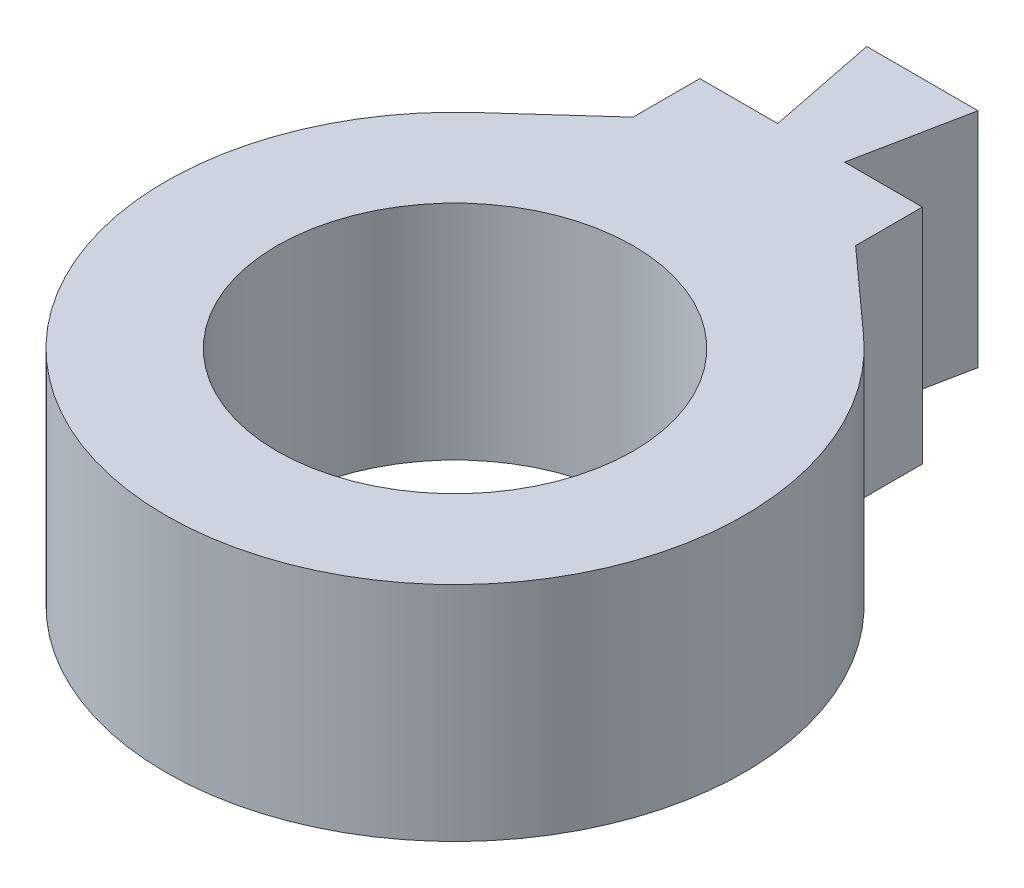
ISO-10303-21;
HEADER;
FILE_DESCRIPTION(('STEP AP214'),'2;1');
FILE_NAME('part.step','',(''),(''),'','','');
FILE_SCHEMA(('AUTOMOTIVE_DESIGN { 1 0 10303 214 1 1 1 1 }'));
ENDSEC;
DATA;
#1=APPLICATION_CONTEXT('core data for automotive mechanical design processes');
#2=APPLICATION_PROTOCOL_DEFINITION('international standard','automotive_design',2000,#1);
#3=PRODUCT_CONTEXT('',#1,'mechanical');
#4=PRODUCT('Part','Part','',(#3));
#5=PRODUCT_RELATED_PRODUCT_CATEGORY('part','',(#4));
#6=PRODUCT_DEFINITION_FORMATION('','',#4);
#7=PRODUCT_DEFINITION_CONTEXT('part definition',#1,'design');
#8=PRODUCT_DEFINITION('design','',#6,#7);
#9=PRODUCT_DEFINITION_SHAPE('','',#8);
#10=(LENGTH_UNIT() NAMED_UNIT(*) SI_UNIT(.MILLI.,.METRE.));
#11=(NAMED_UNIT(*) PLANE_ANGLE_UNIT() SI_UNIT($,.RADIAN.));
#12=(NAMED_UNIT(*) SI_UNIT($,.STERADIAN.) SOLID_ANGLE_UNIT());
#13=UNCERTAINTY_MEASURE_WITH_UNIT(LENGTH_MEASURE(1.E-05),#10,'distance_accuracy_value','');
#14=(GEOMETRIC_REPRESENTATION_CONTEXT(3) GLOBAL_UNCERTAINTY_ASSIGNED_CONTEXT((#13)) GLOBAL_UNIT_ASSIGNED_CONTEXT((#10,
#11,#12)) REPRESENTATION_CONTEXT('',''));
#15=CARTESIAN_POINT('',(0.,0.,0.));
#16=DIRECTION('',(0.,0.,1.));
#17=DIRECTION('',(1.,0.,0.));
#18=AXIS2_PLACEMENT_3D('',#15,#16,#17);
#19=CARTESIAN_POINT('',(5.,10.,16.));
#20=DIRECTION('',(0.,-1.,0.));
#21=DIRECTION('',(0.,0.,-1.));
#22=AXIS2_PLACEMENT_3D('',#19,#20,#21);
#23=CYLINDRICAL_SURFACE('',#22,13.);
#24=CARTESIAN_POINT('',(5.,0.,16.));
#25=DIRECTION('',(0.,1.,0.));
#26=DIRECTION('',(0.,0.,1.));
#27=AXIS2_PLACEMENT_3D('',#24,#25,#26);
#28=CIRCLE('',#27,13.);
#29=CARTESIAN_POINT('',(-3.71134020618557,0.,6.35051546391752));
#30=VERTEX_POINT('',#29);
#31=CARTESIAN_POINT('',(13.7113402061856,0.,6.35051546391752));
#32=VERTEX_POINT('',#31);
#33=EDGE_CURVE('E155',#30,#32,#28,.T.);
#34=ORIENTED_EDGE('',*,*,#33,.T.);
#35=DIRECTION('',(0.,-1.,0.));
#36=VECTOR('',#35,1.);
#37=CARTESIAN_POINT('',(13.7113402061856,10.,6.35051546391752));
#38=LINE('',#37,#36);
#39=CARTESIAN_POINT('',(13.7113402061856,10.,6.35051546391752));
#40=VERTEX_POINT('',#39);
#41=EDGE_CURVE('E11',#40,#32,#38,.T.);
#42=ORIENTED_EDGE('',*,*,#41,.F.);
#43=CARTESIAN_POINT('',(5.,10.,16.));
#44=DIRECTION('',(0.,1.,0.));
#45=DIRECTION('',(0.,0.,1.));
#46=AXIS2_PLACEMENT_3D('',#43,#44,#45);
#47=CIRCLE('',#46,13.);
#48=CARTESIAN_POINT('',(-3.71134020618557,10.,6.35051546391752));
#49=VERTEX_POINT('',#48);
#50=EDGE_CURVE('E99',#49,#40,#47,.T.);
#51=ORIENTED_EDGE('',*,*,#50,.F.);
#52=DIRECTION('',(0.,-1.,0.));
#53=VECTOR('',#52,1.);
#54=CARTESIAN_POINT('',(-3.71134020618557,10.,6.35051546391752));
#55=LINE('',#54,#53);
#56=EDGE_CURVE('E147',#49,#30,#55,.T.);
#57=ORIENTED_EDGE('',*,*,#56,.T.);
#58=EDGE_LOOP('',(#34,#42,#51,#57));
#59=FACE_BOUND('',#58,.T.);
#60=ADVANCED_FACE('F39',(#59),#23,.T.);
#61=CARTESIAN_POINT('',(2.99819321925815,10.,-3.3210755659475));
#62=DIRECTION('',(0.670103092783505,0.,-0.742268041237114));
#63=DIRECTION('',(-0.742268041237114,0.,-0.670103092783505));
#64=AXIS2_PLACEMENT_3D('',#61,#62,#63);
#65=PLANE('',#64);
#66=DIRECTION('',(0.742268041237114,0.,0.670103092783505));
#67=VECTOR('',#66,1.);
#68=CARTESIAN_POINT('',(2.99819321925815,0.,-3.3210755659475));
#69=LINE('',#68,#67);
#70=CARTESIAN_POINT('',(10.,0.,3.));
#71=VERTEX_POINT('',#70);
#72=EDGE_CURVE('E159',#71,#32,#69,.T.);
#73=ORIENTED_EDGE('',*,*,#72,.F.);
#74=DIRECTION('',(0.,-1.,0.));
#75=VECTOR('',#74,1.);
#76=CARTESIAN_POINT('',(10.,10.,3.));
#77=LINE('',#76,#75);
#78=CARTESIAN_POINT('',(10.,10.,3.));
#79=VERTEX_POINT('',#78);
#80=EDGE_CURVE('E49',#79,#71,#77,.T.);
#81=ORIENTED_EDGE('',*,*,#80,.F.);
#82=DIRECTION('',(0.742268041237114,0.,0.670103092783505));
#83=VECTOR('',#82,1.);
#84=CARTESIAN_POINT('',(2.99819321925815,10.,-3.3210755659475));
#85=LINE('',#84,#83);
#86=EDGE_CURVE('E231',#79,#40,#85,.T.);
#87=ORIENTED_EDGE('',*,*,#86,.T.);
#88=ORIENTED_EDGE('',*,*,#41,.T.);
#89=EDGE_LOOP('',(#73,#81,#87,#88));
#90=FACE_BOUND('',#89,.T.);
#91=ADVANCED_FACE('F218',(#90),#65,.T.);
#92=CARTESIAN_POINT('',(10.,10.,0.));
#93=DIRECTION('',(1.,0.,0.));
#94=DIRECTION('',(0.,0.,-1.));
#95=AXIS2_PLACEMENT_3D('',#92,#93,#94);
#96=PLANE('',#95);
#97=DIRECTION('',(0.,0.,1.));
#98=VECTOR('',#97,1.);
#99=CARTESIAN_POINT('',(10.,0.,0.));
#100=LINE('',#99,#98);
#101=CARTESIAN_POINT('',(10.,0.,0.));
#102=VERTEX_POINT('',#101);
#103=EDGE_CURVE('E163',#102,#71,#100,.T.);
#104=ORIENTED_EDGE('',*,*,#103,.F.);
#105=DIRECTION('',(0.,-1.,0.));
#106=VECTOR('',#105,1.);
#107=CARTESIAN_POINT('',(10.,10.,0.));
#108=LINE('',#107,#106);
#109=CARTESIAN_POINT('',(10.,10.,0.));
#110=VERTEX_POINT('',#109);
#111=EDGE_CURVE('E206',#110,#102,#108,.T.);
#112=ORIENTED_EDGE('',*,*,#111,.F.);
#113=DIRECTION('',(0.,0.,1.));
#114=VECTOR('',#113,1.);
#115=CARTESIAN_POINT('',(10.,10.,0.));
#116=LINE('',#115,#114);
#117=EDGE_CURVE('E215',#110,#79,#116,.T.);
#118=ORIENTED_EDGE('',*,*,#117,.T.);
#119=ORIENTED_EDGE('',*,*,#80,.T.);
#120=EDGE_LOOP('',(#104,#112,#118,#119));
#121=FACE_BOUND('',#120,.T.);
#122=ADVANCED_FACE('F213',(#121),#96,.T.);
#123=CARTESIAN_POINT('',(0.,10.,0.));
#124=DIRECTION('',(0.,0.,-1.));
#125=DIRECTION('',(-1.,0.,0.));
#126=AXIS2_PLACEMENT_3D('',#123,#124,#125);
#127=PLANE('',#126);
#128=DIRECTION('',(1.,0.,0.));
#129=VECTOR('',#128,1.);
#130=CARTESIAN_POINT('',(0.,0.,0.));
#131=LINE('',#130,#129);
#132=CARTESIAN_POINT('',(6.5,0.,0.));
#133=VERTEX_POINT('',#132);
#134=EDGE_CURVE('E167',#133,#102,#131,.T.);
#135=ORIENTED_EDGE('',*,*,#134,.F.);
#136=DIRECTION('',(0.,-1.,0.));
#137=VECTOR('',#136,1.);
#138=CARTESIAN_POINT('',(6.5,10.,0.));
#139=LINE('',#138,#137);
#140=CARTESIAN_POINT('',(6.5,10.,0.));
#141=VERTEX_POINT('',#140);
#142=EDGE_CURVE('E203',#141,#133,#139,.T.);
#143=ORIENTED_EDGE('',*,*,#142,.F.);
#144=DIRECTION('',(1.,0.,0.));
#145=VECTOR('',#144,1.);
#146=CARTESIAN_POINT('',(0.,10.,0.));
#147=LINE('',#146,#145);
#148=EDGE_CURVE('E228',#141,#110,#147,.T.);
#149=ORIENTED_EDGE('',*,*,#148,.T.);
#150=ORIENTED_EDGE('',*,*,#111,.T.);
#151=EDGE_LOOP('',(#135,#143,#149,#150));
#152=FACE_BOUND('',#151,.T.);
#153=ADVANCED_FACE('F225',(#152),#127,.T.);
#154=CARTESIAN_POINT('',(6.25,10.,1.25));
#155=DIRECTION('',(0.98058067569092,0.,0.196116135138184));
#156=DIRECTION('',(0.196116135138184,0.,-0.98058067569092));
#157=AXIS2_PLACEMENT_3D('',#154,#155,#156);
#158=PLANE('',#157);
#159=DIRECTION('',(-0.196116135138184,0.,0.98058067569092));
#160=VECTOR('',#159,1.);
#161=CARTESIAN_POINT('',(6.25,0.,1.25));
#162=LINE('',#161,#160);
#163=CARTESIAN_POINT('',(7.5,0.,-5.));
#164=VERTEX_POINT('',#163);
#165=EDGE_CURVE('E171',#164,#133,#162,.T.);
#166=ORIENTED_EDGE('',*,*,#165,.F.);
#167=DIRECTION('',(0.,-1.,0.));
#168=VECTOR('',#167,1.);
#169=CARTESIAN_POINT('',(7.5,10.,-5.));
#170=LINE('',#169,#168);
#171=CARTESIAN_POINT('',(7.5,10.,-5.));
#172=VERTEX_POINT('',#171);
#173=EDGE_CURVE('E200',#172,#164,#170,.T.);
#174=ORIENTED_EDGE('',*,*,#173,.F.);
#175=DIRECTION('',(-0.196116135138184,0.,0.98058067569092));
#176=VECTOR('',#175,1.);
#177=CARTESIAN_POINT('',(6.25,10.,1.25));
#178=LINE('',#177,#176);
#179=EDGE_CURVE('E236',#172,#141,#178,.T.);
#180=ORIENTED_EDGE('',*,*,#179,.T.);
#181=ORIENTED_EDGE('',*,*,#142,.T.);
#182=EDGE_LOOP('',(#166,#174,#180,#181));
#183=FACE_BOUND('',#182,.T.);
#184=ADVANCED_FACE('F274',(#183),#158,.T.);
#185=CARTESIAN_POINT('',(0.,10.,-5.));
#186=DIRECTION('',(0.,0.,-1.));
#187=DIRECTION('',(-1.,0.,0.));
#188=AXIS2_PLACEMENT_3D('',#185,#186,#187);
#189=PLANE('',#188);
#190=DIRECTION('',(1.,0.,0.));
#191=VECTOR('',#190,1.);
#192=CARTESIAN_POINT('',(0.,0.,-5.));
#193=LINE('',#192,#191);
#194=CARTESIAN_POINT('',(2.5,0.,-5.));
#195=VERTEX_POINT('',#194);
#196=EDGE_CURVE('E175',#195,#164,#193,.T.);
#197=ORIENTED_EDGE('',*,*,#196,.F.);
#198=DIRECTION('',(0.,-1.,0.));
#199=VECTOR('',#198,1.);
#200=CARTESIAN_POINT('',(2.5,10.,-5.));
#201=LINE('',#200,#199);
#202=CARTESIAN_POINT('',(2.5,10.,-5.));
#203=VERTEX_POINT('',#202);
#204=EDGE_CURVE('E197',#203,#195,#201,.T.);
#205=ORIENTED_EDGE('',*,*,#204,.F.);
#206=DIRECTION('',(1.,0.,0.));
#207=VECTOR('',#206,1.);
#208=CARTESIAN_POINT('',(0.,10.,-5.));
#209=LINE('',#208,#207);
#210=EDGE_CURVE('E243',#203,#172,#209,.T.);
#211=ORIENTED_EDGE('',*,*,#210,.T.);
#212=ORIENTED_EDGE('',*,*,#173,.T.);
#213=EDGE_LOOP('',(#197,#205,#211,#212));
#214=FACE_BOUND('',#213,.T.);
#215=ADVANCED_FACE('F277',(#214),#189,.T.);
#216=CARTESIAN_POINT('',(3.36538461538461,10.,-0.673076923076922));
#217=DIRECTION('',(-0.98058067569092,0.,0.196116135138184));
#218=DIRECTION('',(0.196116135138184,0.,0.98058067569092));
#219=AXIS2_PLACEMENT_3D('',#216,#217,#218);
#220=PLANE('',#219);
#221=DIRECTION('',(-0.196116135138184,0.,-0.98058067569092));
#222=VECTOR('',#221,1.);
#223=CARTESIAN_POINT('',(3.36538461538461,0.,-0.673076923076922));
#224=LINE('',#223,#222);
#225=CARTESIAN_POINT('',(3.5,0.,0.));
#226=VERTEX_POINT('',#225);
#227=EDGE_CURVE('E179',#226,#195,#224,.T.);
#228=ORIENTED_EDGE('',*,*,#227,.F.);
#229=DIRECTION('',(0.,-1.,0.));
#230=VECTOR('',#229,1.);
#231=CARTESIAN_POINT('',(3.5,10.,0.));
#232=LINE('',#231,#230);
#233=CARTESIAN_POINT('',(3.5,10.,0.));
#234=VERTEX_POINT('',#233);
#235=EDGE_CURVE('E133',#234,#226,#232,.T.);
#236=ORIENTED_EDGE('',*,*,#235,.F.);
#237=DIRECTION('',(-0.196116135138184,0.,-0.98058067569092));
#238=VECTOR('',#237,1.);
#239=CARTESIAN_POINT('',(3.36538461538461,10.,-0.673076923076922));
#240=LINE('',#239,#238);
#241=EDGE_CURVE('E140',#234,#203,#240,.T.);
#242=ORIENTED_EDGE('',*,*,#241,.T.);
#243=ORIENTED_EDGE('',*,*,#204,.T.);
#244=EDGE_LOOP('',(#228,#236,#242,#243));
#245=FACE_BOUND('',#244,.T.);
#246=ADVANCED_FACE('F249',(#245),#220,.T.);
#247=CARTESIAN_POINT('',(0.,10.,0.));
#248=DIRECTION('',(0.,0.,-1.));
#249=DIRECTION('',(-1.,0.,0.));
#250=AXIS2_PLACEMENT_3D('',#247,#248,#249);
#251=PLANE('',#250);
#252=DIRECTION('',(1.,0.,0.));
#253=VECTOR('',#252,1.);
#254=CARTESIAN_POINT('',(0.,0.,0.));
#255=LINE('',#254,#253);
#256=CARTESIAN_POINT('',(0.,0.,0.));
#257=VERTEX_POINT('',#256);
#258=EDGE_CURVE('E127',#257,#226,#255,.T.);
#259=ORIENTED_EDGE('',*,*,#258,.F.);
#260=DIRECTION('',(0.,-1.,0.));
#261=VECTOR('',#260,1.);
#262=CARTESIAN_POINT('',(0.,10.,0.));
#263=LINE('',#262,#261);
#264=CARTESIAN_POINT('',(0.,10.,0.));
#265=VERTEX_POINT('',#264);
#266=EDGE_CURVE('E122',#265,#257,#263,.T.);
#267=ORIENTED_EDGE('',*,*,#266,.F.);
#268=DIRECTION('',(1.,0.,0.));
#269=VECTOR('',#268,1.);
#270=CARTESIAN_POINT('',(0.,10.,0.));
#271=LINE('',#270,#269);
#272=EDGE_CURVE('E125',#265,#234,#271,.T.);
#273=ORIENTED_EDGE('',*,*,#272,.T.);
#274=ORIENTED_EDGE('',*,*,#235,.T.);
#275=EDGE_LOOP('',(#259,#267,#273,#274));
#276=FACE_BOUND('',#275,.T.);
#277=ADVANCED_FACE('F124',(#276),#251,.T.);
#278=CARTESIAN_POINT('',(0.,10.,0.));
#279=DIRECTION('',(-1.,0.,0.));
#280=DIRECTION('',(0.,0.,1.));
#281=AXIS2_PLACEMENT_3D('',#278,#279,#280);
#282=PLANE('',#281);
#283=DIRECTION('',(0.,0.,-1.));
#284=VECTOR('',#283,1.);
#285=CARTESIAN_POINT('',(0.,0.,0.));
#286=LINE('',#285,#284);
#287=CARTESIAN_POINT('',(0.,0.,3.));
#288=VERTEX_POINT('',#287);
#289=EDGE_CURVE('E185',#288,#257,#286,.T.);
#290=ORIENTED_EDGE('',*,*,#289,.F.);
#291=DIRECTION('',(0.,-1.,0.));
#292=VECTOR('',#291,1.);
#293=CARTESIAN_POINT('',(0.,10.,3.));
#294=LINE('',#293,#292);
#295=CARTESIAN_POINT('',(0.,10.,3.));
#296=VERTEX_POINT('',#295);
#297=EDGE_CURVE('E90',#296,#288,#294,.T.);
#298=ORIENTED_EDGE('',*,*,#297,.F.);
#299=DIRECTION('',(0.,0.,-1.));
#300=VECTOR('',#299,1.);
#301=CARTESIAN_POINT('',(0.,10.,0.));
#302=LINE('',#301,#300);
#303=EDGE_CURVE('E137',#296,#265,#302,.T.);
#304=ORIENTED_EDGE('',*,*,#303,.T.);
#305=ORIENTED_EDGE('',*,*,#266,.T.);
#306=EDGE_LOOP('',(#290,#298,#304,#305));
#307=FACE_BOUND('',#306,.T.);
#308=ADVANCED_FACE('F143',(#307),#282,.T.);
#309=CARTESIAN_POINT('',(5.,10.,16.));
#310=DIRECTION('',(0.,-1.,0.));
#311=DIRECTION('',(0.,0.,-1.));
#312=AXIS2_PLACEMENT_3D('',#309,#310,#311);
#313=CYLINDRICAL_SURFACE('',#312,8.);
#314=CARTESIAN_POINT('',(5.,10.,16.));
#315=DIRECTION('',(0.,1.,0.));
#316=DIRECTION('',(0.,0.,1.));
#317=AXIS2_PLACEMENT_3D('',#314,#315,#316);
#318=CIRCLE('',#317,8.);
#319=CARTESIAN_POINT('',(5.,10.,24.));
#320=VERTEX_POINT('',#319);
#321=EDGE_CURVE('E190',#320,#320,#318,.T.);
#322=ORIENTED_EDGE('',*,*,#321,.T.);
#323=EDGE_LOOP('',(#322));
#324=FACE_BOUND('',#323,.T.);
#325=CARTESIAN_POINT('',(5.,0.,16.));
#326=DIRECTION('',(0.,1.,0.));
#327=DIRECTION('',(0.,0.,1.));
#328=AXIS2_PLACEMENT_3D('',#325,#326,#327);
#329=CIRCLE('',#328,8.);
#330=CARTESIAN_POINT('',(5.,0.,24.));
#331=VERTEX_POINT('',#330);
#332=EDGE_CURVE('E151',#331,#331,#329,.T.);
#333=ORIENTED_EDGE('',*,*,#332,.F.);
#334=EDGE_LOOP('',(#333));
#335=FACE_BOUND('',#334,.T.);
#336=ADVANCED_FACE('F41',(#324,#335),#313,.F.);
#337=CARTESIAN_POINT('',(1.49218833032203,10.,1.65288553512594));
#338=DIRECTION('',(0.670103092783505,0.,0.742268041237114));
#339=DIRECTION('',(0.742268041237114,0.,-0.670103092783505));
#340=AXIS2_PLACEMENT_3D('',#337,#338,#339);
#341=PLANE('',#340);
#342=DIRECTION('',(-0.742268041237114,0.,0.670103092783505));
#343=VECTOR('',#342,1.);
#344=CARTESIAN_POINT('',(1.49218833032203,0.,1.65288553512594));
#345=LINE('',#344,#343);
#346=EDGE_CURVE('E93',#288,#30,#345,.T.);
#347=ORIENTED_EDGE('',*,*,#346,.T.);
#348=ORIENTED_EDGE('',*,*,#56,.F.);
#349=DIRECTION('',(-0.742268041237114,0.,0.670103092783505));
#350=VECTOR('',#349,1.);
#351=CARTESIAN_POINT('',(1.49218833032203,10.,1.65288553512594));
#352=LINE('',#351,#350);
#353=EDGE_CURVE('E57',#296,#49,#352,.T.);
#354=ORIENTED_EDGE('',*,*,#353,.F.);
#355=ORIENTED_EDGE('',*,*,#297,.T.);
#356=EDGE_LOOP('',(#347,#348,#354,#355));
#357=FACE_BOUND('',#356,.T.);
#358=ADVANCED_FACE('F252',(#357),#341,.F.);
#359=CARTESIAN_POINT('',(0.,10.,0.));
#360=DIRECTION('',(0.,1.,0.));
#361=DIRECTION('',(0.,0.,1.));
#362=AXIS2_PLACEMENT_3D('',#359,#360,#361);
#363=PLANE('',#362);
#364=ORIENTED_EDGE('',*,*,#321,.F.);
#365=EDGE_LOOP('',(#364));
#366=FACE_BOUND('',#365,.T.);
#367=ORIENTED_EDGE('',*,*,#50,.T.);
#368=ORIENTED_EDGE('',*,*,#86,.F.);
#369=ORIENTED_EDGE('',*,*,#117,.F.);
#370=ORIENTED_EDGE('',*,*,#148,.F.);
#371=ORIENTED_EDGE('',*,*,#179,.F.);
#372=ORIENTED_EDGE('',*,*,#210,.F.);
#373=ORIENTED_EDGE('',*,*,#241,.F.);
#374=ORIENTED_EDGE('',*,*,#272,.F.);
#375=ORIENTED_EDGE('',*,*,#303,.F.);
#376=ORIENTED_EDGE('',*,*,#353,.T.);
#377=EDGE_LOOP('',(#367,#368,#369,#370,#371,#372,#373,#374,#375,#376));
#378=FACE_BOUND('',#377,.T.);
#379=ADVANCED_FACE('F136',(#366,#378),#363,.T.);
#380=CARTESIAN_POINT('',(0.,0.,0.));
#381=DIRECTION('',(0.,1.,0.));
#382=DIRECTION('',(0.,0.,1.));
#383=AXIS2_PLACEMENT_3D('',#380,#381,#382);
#384=PLANE('',#383);
#385=ORIENTED_EDGE('',*,*,#332,.T.);
#386=EDGE_LOOP('',(#385));
#387=FACE_BOUND('',#386,.T.);
#388=ORIENTED_EDGE('',*,*,#33,.F.);
#389=ORIENTED_EDGE('',*,*,#346,.F.);
#390=ORIENTED_EDGE('',*,*,#289,.T.);
#391=ORIENTED_EDGE('',*,*,#258,.T.);
#392=ORIENTED_EDGE('',*,*,#227,.T.);
#393=ORIENTED_EDGE('',*,*,#196,.T.);
#394=ORIENTED_EDGE('',*,*,#165,.T.);
#395=ORIENTED_EDGE('',*,*,#134,.T.);
#396=ORIENTED_EDGE('',*,*,#103,.T.);
#397=ORIENTED_EDGE('',*,*,#72,.T.);
#398=EDGE_LOOP('',(#388,#389,#390,#391,#392,#393,#394,#395,#396,#397));
#399=FACE_BOUND('',#398,.T.);
#400=ADVANCED_FACE('F221',(#387,#399),#384,.F.);
#401=CLOSED_SHELL('',(#60,#91,#122,#153,#184,#215,#246,#277,#308,#336,#358,#379,#400));
#402=MANIFOLD_SOLID_BREP('B2',#401);
#403=ADVANCED_BREP_SHAPE_REPRESENTATION('',(#18,#402),#14);
#404=SHAPE_DEFINITION_REPRESENTATION(#9,#403);
ENDSEC;
END-ISO-10303-21;
